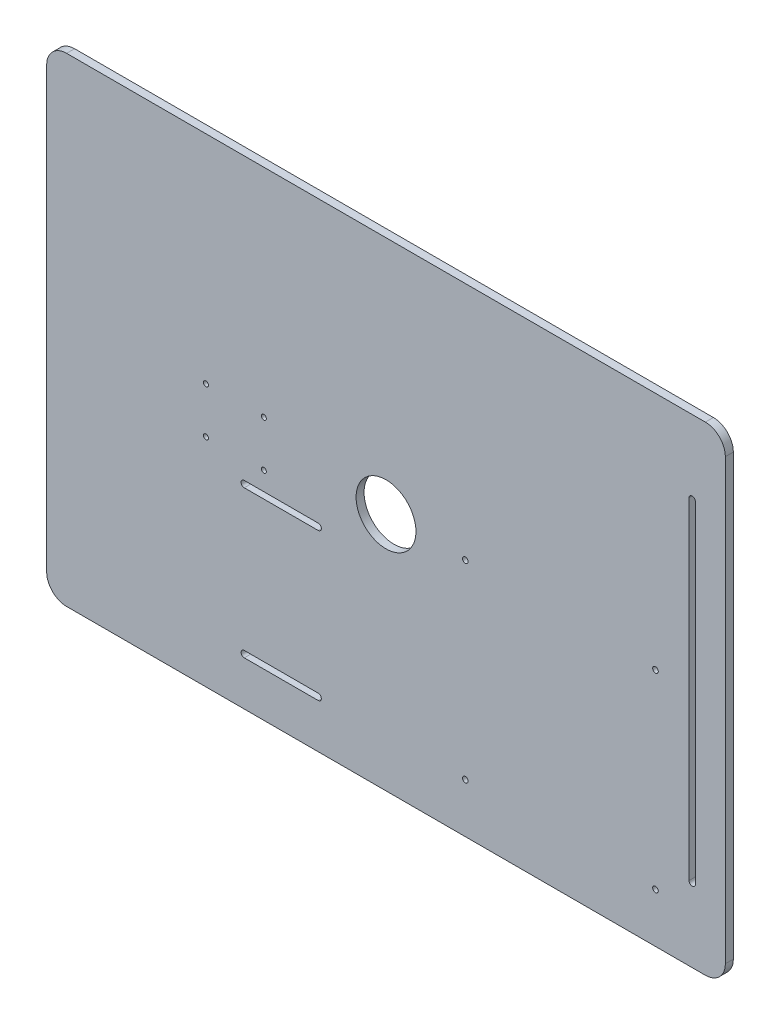
ISO-10303-21;
HEADER;
FILE_DESCRIPTION(('STEP AP214'),'2;1');
FILE_NAME('part.step','',(''),(''),'','','');
FILE_SCHEMA(('AUTOMOTIVE_DESIGN { 1 0 10303 214 1 1 1 1 }'));
ENDSEC;
DATA;
#1=APPLICATION_CONTEXT('core data for automotive mechanical design processes');
#2=APPLICATION_PROTOCOL_DEFINITION('international standard','automotive_design',2000,#1);
#3=PRODUCT_CONTEXT('',#1,'mechanical');
#4=PRODUCT('Part','Part','',(#3));
#5=PRODUCT_RELATED_PRODUCT_CATEGORY('part','',(#4));
#6=PRODUCT_DEFINITION_FORMATION('','',#4);
#7=PRODUCT_DEFINITION_CONTEXT('part definition',#1,'design');
#8=PRODUCT_DEFINITION('design','',#6,#7);
#9=PRODUCT_DEFINITION_SHAPE('','',#8);
#10=(LENGTH_UNIT() NAMED_UNIT(*) SI_UNIT(.MILLI.,.METRE.));
#11=(NAMED_UNIT(*) PLANE_ANGLE_UNIT() SI_UNIT($,.RADIAN.));
#12=(NAMED_UNIT(*) SI_UNIT($,.STERADIAN.) SOLID_ANGLE_UNIT());
#13=UNCERTAINTY_MEASURE_WITH_UNIT(LENGTH_MEASURE(1.E-05),#10,'distance_accuracy_value','');
#14=(GEOMETRIC_REPRESENTATION_CONTEXT(3) GLOBAL_UNCERTAINTY_ASSIGNED_CONTEXT((#13)) GLOBAL_UNIT_ASSIGNED_CONTEXT((#10,
#11,#12)) REPRESENTATION_CONTEXT('',''));
#15=CARTESIAN_POINT('',(0.,0.,0.));
#16=DIRECTION('',(0.,0.,1.));
#17=DIRECTION('',(1.,0.,0.));
#18=AXIS2_PLACEMENT_3D('',#15,#16,#17);
#19=CARTESIAN_POINT('',(160.,110.,4.));
#20=DIRECTION('',(0.,0.,1.));
#21=DIRECTION('',(1.,0.,0.));
#22=AXIS2_PLACEMENT_3D('',#19,#20,#21);
#23=PLANE('',#22);
#24=CARTESIAN_POINT('',(0.,0.,4.));
#25=DIRECTION('',(0.,0.,1.));
#26=DIRECTION('',(1.,0.,0.));
#27=AXIS2_PLACEMENT_3D('',#24,#25,#26);
#28=CIRCLE('',#27,15.);
#29=CARTESIAN_POINT('',(15.,0.,4.));
#30=VERTEX_POINT('',#29);
#31=EDGE_CURVE('E209',#30,#30,#28,.F.);
#32=ORIENTED_EDGE('',*,*,#31,.T.);
#33=EDGE_LOOP('',(#32));
#34=FACE_BOUND('',#33,.T.);
#35=CARTESIAN_POINT('',(135.,0.,4.));
#36=DIRECTION('',(0.,0.,1.));
#37=DIRECTION('',(1.,0.,0.));
#38=AXIS2_PLACEMENT_3D('',#35,#36,#37);
#39=CIRCLE('',#38,1.39999999999934);
#40=CARTESIAN_POINT('',(136.4,0.,4.));
#41=VERTEX_POINT('',#40);
#42=EDGE_CURVE('E272',#41,#41,#39,.F.);
#43=ORIENTED_EDGE('',*,*,#42,.T.);
#44=EDGE_LOOP('',(#43));
#45=FACE_BOUND('',#44,.T.);
#46=CARTESIAN_POINT('',(135.,-95.25,4.));
#47=DIRECTION('',(0.,0.,1.));
#48=DIRECTION('',(1.,0.,0.));
#49=AXIS2_PLACEMENT_3D('',#46,#47,#48);
#50=CIRCLE('',#49,1.39999999999977);
#51=CARTESIAN_POINT('',(136.4,-95.25,4.));
#52=VERTEX_POINT('',#51);
#53=EDGE_CURVE('E266',#52,#52,#50,.F.);
#54=ORIENTED_EDGE('',*,*,#53,.T.);
#55=EDGE_LOOP('',(#54));
#56=FACE_BOUND('',#55,.T.);
#57=CARTESIAN_POINT('',(153.4,83.0000013493322,4.));
#58=DIRECTION('',(0.,0.,1.));
#59=DIRECTION('',(1.,0.,0.));
#60=AXIS2_PLACEMENT_3D('',#57,#58,#59);
#61=CIRCLE('',#60,1.60000000000056);
#62=CARTESIAN_POINT('',(155.,83.,4.));
#63=VERTEX_POINT('',#62);
#64=CARTESIAN_POINT('',(151.8,83.,4.));
#65=VERTEX_POINT('',#64);
#66=EDGE_CURVE('E305',#63,#65,#61,.T.);
#67=ORIENTED_EDGE('',*,*,#66,.F.);
#68=DIRECTION('',(0.,1.,0.));
#69=VECTOR('',#68,1.);
#70=CARTESIAN_POINT('',(155.,110.,4.));
#71=LINE('',#70,#69);
#72=CARTESIAN_POINT('',(155.,-83.,4.));
#73=VERTEX_POINT('',#72);
#74=EDGE_CURVE('E292',#73,#63,#71,.T.);
#75=ORIENTED_EDGE('',*,*,#74,.F.);
#76=CARTESIAN_POINT('',(153.4,-83.0000013493322,4.));
#77=DIRECTION('',(0.,0.,1.));
#78=DIRECTION('',(1.,0.,0.));
#79=AXIS2_PLACEMENT_3D('',#76,#77,#78);
#80=CIRCLE('',#79,1.60000000000056);
#81=CARTESIAN_POINT('',(151.8,-83.,4.));
#82=VERTEX_POINT('',#81);
#83=EDGE_CURVE('E300',#73,#82,#80,.F.);
#84=ORIENTED_EDGE('',*,*,#83,.T.);
#85=DIRECTION('',(0.,-1.,0.));
#86=VECTOR('',#85,1.);
#87=CARTESIAN_POINT('',(151.8,110.,4.));
#88=LINE('',#87,#86);
#89=EDGE_CURVE('E303',#65,#82,#88,.T.);
#90=ORIENTED_EDGE('',*,*,#89,.F.);
#91=EDGE_LOOP('',(#67,#75,#84,#90));
#92=FACE_BOUND('',#91,.T.);
#93=CARTESIAN_POINT('',(-61.2053172509983,11.5,4.));
#94=DIRECTION('',(0.,0.,1.));
#95=DIRECTION('',(1.,0.,0.));
#96=AXIS2_PLACEMENT_3D('',#93,#94,#95);
#97=CIRCLE('',#96,1.25);
#98=CARTESIAN_POINT('',(-59.9553172509983,11.5,4.));
#99=VERTEX_POINT('',#98);
#100=EDGE_CURVE('E307',#99,#99,#97,.F.);
#101=ORIENTED_EDGE('',*,*,#100,.T.);
#102=EDGE_LOOP('',(#101));
#103=FACE_BOUND('',#102,.T.);
#104=CARTESIAN_POINT('',(-90.2053172509983,11.5,4.));
#105=DIRECTION('',(0.,0.,1.));
#106=DIRECTION('',(1.,0.,0.));
#107=AXIS2_PLACEMENT_3D('',#104,#105,#106);
#108=CIRCLE('',#107,1.25);
#109=CARTESIAN_POINT('',(-88.9553172509983,11.5,4.));
#110=VERTEX_POINT('',#109);
#111=EDGE_CURVE('E316',#110,#110,#108,.F.);
#112=ORIENTED_EDGE('',*,*,#111,.T.);
#113=EDGE_LOOP('',(#112));
#114=FACE_BOUND('',#113,.T.);
#115=CARTESIAN_POINT('',(160.,110.,4.));
#116=DIRECTION('',(0.,0.,1.));
#117=DIRECTION('',(1.,0.,0.));
#118=AXIS2_PLACEMENT_3D('',#115,#116,#117);
#119=CIRCLE('',#118,10.);
#120=CARTESIAN_POINT('',(170.,110.,4.));
#121=VERTEX_POINT('',#120);
#122=CARTESIAN_POINT('',(160.,120.,4.));
#123=VERTEX_POINT('',#122);
#124=EDGE_CURVE('E320',#121,#123,#119,.T.);
#125=ORIENTED_EDGE('',*,*,#124,.T.);
#126=DIRECTION('',(-1.,0.,0.));
#127=VECTOR('',#126,1.);
#128=CARTESIAN_POINT('',(160.,120.,4.));
#129=LINE('',#128,#127);
#130=CARTESIAN_POINT('',(-160.,120.,4.));
#131=VERTEX_POINT('',#130);
#132=EDGE_CURVE('E323',#123,#131,#129,.T.);
#133=ORIENTED_EDGE('',*,*,#132,.T.);
#134=CARTESIAN_POINT('',(-160.,110.,4.));
#135=DIRECTION('',(0.,0.,-1.));
#136=DIRECTION('',(-1.,0.,0.));
#137=AXIS2_PLACEMENT_3D('',#134,#135,#136);
#138=CIRCLE('',#137,10.);
#139=CARTESIAN_POINT('',(-170.,110.,4.));
#140=VERTEX_POINT('',#139);
#141=EDGE_CURVE('E326',#140,#131,#138,.T.);
#142=ORIENTED_EDGE('',*,*,#141,.F.);
#143=DIRECTION('',(0.,1.,0.));
#144=VECTOR('',#143,1.);
#145=CARTESIAN_POINT('',(-170.,-110.,4.));
#146=LINE('',#145,#144);
#147=CARTESIAN_POINT('',(-170.,-110.,4.));
#148=VERTEX_POINT('',#147);
#149=EDGE_CURVE('E329',#148,#140,#146,.T.);
#150=ORIENTED_EDGE('',*,*,#149,.F.);
#151=CARTESIAN_POINT('',(-160.,-110.,4.));
#152=DIRECTION('',(0.,0.,-1.));
#153=DIRECTION('',(-1.,0.,0.));
#154=AXIS2_PLACEMENT_3D('',#151,#152,#153);
#155=CIRCLE('',#154,10.);
#156=CARTESIAN_POINT('',(-160.,-120.,4.));
#157=VERTEX_POINT('',#156);
#158=EDGE_CURVE('E332',#157,#148,#155,.T.);
#159=ORIENTED_EDGE('',*,*,#158,.F.);
#160=DIRECTION('',(-1.,0.,0.));
#161=VECTOR('',#160,1.);
#162=CARTESIAN_POINT('',(160.,-120.,4.));
#163=LINE('',#162,#161);
#164=CARTESIAN_POINT('',(160.,-120.,4.));
#165=VERTEX_POINT('',#164);
#166=EDGE_CURVE('E335',#165,#157,#163,.T.);
#167=ORIENTED_EDGE('',*,*,#166,.F.);
#168=CARTESIAN_POINT('',(160.,-110.,4.));
#169=DIRECTION('',(0.,0.,1.));
#170=DIRECTION('',(1.,0.,0.));
#171=AXIS2_PLACEMENT_3D('',#168,#169,#170);
#172=CIRCLE('',#171,10.);
#173=CARTESIAN_POINT('',(170.,-110.,4.));
#174=VERTEX_POINT('',#173);
#175=EDGE_CURVE('E338',#165,#174,#172,.T.);
#176=ORIENTED_EDGE('',*,*,#175,.T.);
#177=DIRECTION('',(0.,1.,0.));
#178=VECTOR('',#177,1.);
#179=CARTESIAN_POINT('',(170.,-110.,4.));
#180=LINE('',#179,#178);
#181=EDGE_CURVE('E340',#174,#121,#180,.T.);
#182=ORIENTED_EDGE('',*,*,#181,.T.);
#183=EDGE_LOOP('',(#125,#133,#142,#150,#159,#167,#176,#182));
#184=FACE_BOUND('',#183,.T.);
#185=CARTESIAN_POINT('',(-90.2053172509983,-11.5,4.));
#186=DIRECTION('',(0.,0.,1.));
#187=DIRECTION('',(1.,0.,0.));
#188=AXIS2_PLACEMENT_3D('',#185,#186,#187);
#189=CIRCLE('',#188,1.25);
#190=CARTESIAN_POINT('',(-88.9553172509983,-11.5,4.));
#191=VERTEX_POINT('',#190);
#192=EDGE_CURVE('E381',#191,#191,#189,.F.);
#193=ORIENTED_EDGE('',*,*,#192,.T.);
#194=EDGE_LOOP('',(#193));
#195=FACE_BOUND('',#194,.T.);
#196=CARTESIAN_POINT('',(-61.2053172509983,-11.5,4.));
#197=DIRECTION('',(0.,0.,1.));
#198=DIRECTION('',(1.,0.,0.));
#199=AXIS2_PLACEMENT_3D('',#196,#197,#198);
#200=CIRCLE('',#199,1.25);
#201=CARTESIAN_POINT('',(-59.9553172509983,-11.5,4.));
#202=VERTEX_POINT('',#201);
#203=EDGE_CURVE('E49',#202,#202,#200,.F.);
#204=ORIENTED_EDGE('',*,*,#203,.T.);
#205=EDGE_LOOP('',(#204));
#206=FACE_BOUND('',#205,.T.);
#207=CARTESIAN_POINT('',(39.7500000000004,0.,4.));
#208=DIRECTION('',(0.,0.,1.));
#209=DIRECTION('',(1.,0.,0.));
#210=AXIS2_PLACEMENT_3D('',#207,#208,#209);
#211=CIRCLE('',#210,1.39999999999939);
#212=CARTESIAN_POINT('',(41.1499999999997,0.,4.));
#213=VERTEX_POINT('',#212);
#214=EDGE_CURVE('E269',#213,#213,#211,.T.);
#215=ORIENTED_EDGE('',*,*,#214,.F.);
#216=EDGE_LOOP('',(#215));
#217=FACE_BOUND('',#216,.T.);
#218=CARTESIAN_POINT('',(39.75,-95.2499999999997,4.));
#219=DIRECTION('',(0.,0.,1.));
#220=DIRECTION('',(1.,0.,0.));
#221=AXIS2_PLACEMENT_3D('',#218,#219,#220);
#222=CIRCLE('',#221,1.39999999999957);
#223=CARTESIAN_POINT('',(41.1499999999996,-95.2499999999997,4.));
#224=VERTEX_POINT('',#223);
#225=EDGE_CURVE('E275',#224,#224,#222,.T.);
#226=ORIENTED_EDGE('',*,*,#225,.F.);
#227=EDGE_LOOP('',(#226));
#228=FACE_BOUND('',#227,.T.);
#229=DIRECTION('',(-1.,0.,0.));
#230=VECTOR('',#229,1.);
#231=CARTESIAN_POINT('',(160.,-97.7703170461152,4.));
#232=LINE('',#231,#230);
#233=CARTESIAN_POINT('',(-34.,-97.7703170461153,4.));
#234=VERTEX_POINT('',#233);
#235=CARTESIAN_POINT('',(-71.,-97.7703170461153,4.));
#236=VERTEX_POINT('',#235);
#237=EDGE_CURVE('E239',#234,#236,#232,.T.);
#238=ORIENTED_EDGE('',*,*,#237,.T.);
#239=CARTESIAN_POINT('',(-71.,-96.1703170461153,4.));
#240=DIRECTION('',(0.,0.,1.));
#241=DIRECTION('',(1.,0.,0.));
#242=AXIS2_PLACEMENT_3D('',#239,#240,#241);
#243=CIRCLE('',#242,1.60000000000001);
#244=CARTESIAN_POINT('',(-71.,-94.5703170461152,4.));
#245=VERTEX_POINT('',#244);
#246=EDGE_CURVE('E242',#236,#245,#243,.F.);
#247=ORIENTED_EDGE('',*,*,#246,.T.);
#248=DIRECTION('',(1.,0.,0.));
#249=VECTOR('',#248,1.);
#250=CARTESIAN_POINT('',(160.,-94.5703170461154,4.));
#251=LINE('',#250,#249);
#252=CARTESIAN_POINT('',(-34.,-94.5703170461153,4.));
#253=VERTEX_POINT('',#252);
#254=EDGE_CURVE('E188',#245,#253,#251,.T.);
#255=ORIENTED_EDGE('',*,*,#254,.T.);
#256=CARTESIAN_POINT('',(-34.,-96.1703170461153,4.));
#257=DIRECTION('',(0.,0.,1.));
#258=DIRECTION('',(1.,0.,0.));
#259=AXIS2_PLACEMENT_3D('',#256,#257,#258);
#260=CIRCLE('',#259,1.6);
#261=EDGE_CURVE('E236',#253,#234,#260,.F.);
#262=ORIENTED_EDGE('',*,*,#261,.T.);
#263=EDGE_LOOP('',(#238,#247,#255,#262));
#264=FACE_BOUND('',#263,.T.);
#265=DIRECTION('',(1.,0.,0.));
#266=VECTOR('',#265,1.);
#267=CARTESIAN_POINT('',(160.,-20.8,4.));
#268=LINE('',#267,#266);
#269=CARTESIAN_POINT('',(-71.,-20.8,4.));
#270=VERTEX_POINT('',#269);
#271=CARTESIAN_POINT('',(-34.,-20.8,4.));
#272=VERTEX_POINT('',#271);
#273=EDGE_CURVE('E251',#270,#272,#268,.T.);
#274=ORIENTED_EDGE('',*,*,#273,.T.);
#275=CARTESIAN_POINT('',(-34.,-22.4,4.));
#276=DIRECTION('',(0.,0.,1.));
#277=DIRECTION('',(1.,0.,0.));
#278=AXIS2_PLACEMENT_3D('',#275,#276,#277);
#279=CIRCLE('',#278,1.6);
#280=CARTESIAN_POINT('',(-34.,-24.,4.));
#281=VERTEX_POINT('',#280);
#282=EDGE_CURVE('E185',#272,#281,#279,.F.);
#283=ORIENTED_EDGE('',*,*,#282,.T.);
#284=DIRECTION('',(-1.,0.,0.));
#285=VECTOR('',#284,1.);
#286=CARTESIAN_POINT('',(160.,-23.9999999999999,4.));
#287=LINE('',#286,#285);
#288=CARTESIAN_POINT('',(-71.,-24.,4.));
#289=VERTEX_POINT('',#288);
#290=EDGE_CURVE('E245',#281,#289,#287,.T.);
#291=ORIENTED_EDGE('',*,*,#290,.T.);
#292=CARTESIAN_POINT('',(-71.,-22.4,4.));
#293=DIRECTION('',(0.,0.,1.));
#294=DIRECTION('',(1.,0.,0.));
#295=AXIS2_PLACEMENT_3D('',#292,#293,#294);
#296=CIRCLE('',#295,1.6);
#297=EDGE_CURVE('E248',#289,#270,#296,.F.);
#298=ORIENTED_EDGE('',*,*,#297,.T.);
#299=EDGE_LOOP('',(#274,#283,#291,#298));
#300=FACE_BOUND('',#299,.T.);
#301=ADVANCED_FACE('F41',(#34,#45,#56,#92,#103,#114,#184,#195,#206,#217,#228,#264,#300),#23,.T.);
#302=CARTESIAN_POINT('',(160.,110.,0.));
#303=DIRECTION('',(0.,0.,1.));
#304=DIRECTION('',(1.,0.,0.));
#305=AXIS2_PLACEMENT_3D('',#302,#303,#304);
#306=PLANE('',#305);
#307=CARTESIAN_POINT('',(0.,0.,0.));
#308=DIRECTION('',(0.,0.,1.));
#309=DIRECTION('',(1.,0.,0.));
#310=AXIS2_PLACEMENT_3D('',#307,#308,#309);
#311=CIRCLE('',#310,15.);
#312=CARTESIAN_POINT('',(15.,0.,0.));
#313=VERTEX_POINT('',#312);
#314=EDGE_CURVE('E641',#313,#313,#311,.T.);
#315=ORIENTED_EDGE('',*,*,#314,.T.);
#316=EDGE_LOOP('',(#315));
#317=FACE_BOUND('',#316,.T.);
#318=CARTESIAN_POINT('',(-71.,-96.1703170461153,0.));
#319=DIRECTION('',(0.,0.,1.));
#320=DIRECTION('',(1.,0.,0.));
#321=AXIS2_PLACEMENT_3D('',#318,#319,#320);
#322=CIRCLE('',#321,1.60000000000001);
#323=CARTESIAN_POINT('',(-71.,-94.5703170461153,0.));
#324=VERTEX_POINT('',#323);
#325=CARTESIAN_POINT('',(-71.,-97.7703170461153,0.));
#326=VERTEX_POINT('',#325);
#327=EDGE_CURVE('E203',#324,#326,#322,.T.);
#328=ORIENTED_EDGE('',*,*,#327,.T.);
#329=DIRECTION('',(1.,0.,0.));
#330=VECTOR('',#329,1.);
#331=CARTESIAN_POINT('',(-34.,-97.7703170461153,0.));
#332=LINE('',#331,#330);
#333=CARTESIAN_POINT('',(-34.,-97.7703170461153,0.));
#334=VERTEX_POINT('',#333);
#335=EDGE_CURVE('E206',#326,#334,#332,.T.);
#336=ORIENTED_EDGE('',*,*,#335,.T.);
#337=CARTESIAN_POINT('',(-34.,-96.1703170461153,0.));
#338=DIRECTION('',(0.,0.,1.));
#339=DIRECTION('',(-1.,0.,0.));
#340=AXIS2_PLACEMENT_3D('',#337,#338,#339);
#341=CIRCLE('',#340,1.6);
#342=CARTESIAN_POINT('',(-34.,-94.5703170461153,0.));
#343=VERTEX_POINT('',#342);
#344=EDGE_CURVE('E229',#334,#343,#341,.T.);
#345=ORIENTED_EDGE('',*,*,#344,.T.);
#346=DIRECTION('',(-1.,0.,0.));
#347=VECTOR('',#346,1.);
#348=CARTESIAN_POINT('',(-34.,-94.5703170461153,0.));
#349=LINE('',#348,#347);
#350=EDGE_CURVE('E226',#343,#324,#349,.T.);
#351=ORIENTED_EDGE('',*,*,#350,.T.);
#352=EDGE_LOOP('',(#328,#336,#345,#351));
#353=FACE_BOUND('',#352,.T.);
#354=CARTESIAN_POINT('',(39.7500000000004,0.,0.));
#355=DIRECTION('',(0.,0.,-1.));
#356=DIRECTION('',(-1.,0.,0.));
#357=AXIS2_PLACEMENT_3D('',#354,#355,#356);
#358=CIRCLE('',#357,1.39999999999939);
#359=CARTESIAN_POINT('',(38.350000000001,0.,0.));
#360=VERTEX_POINT('',#359);
#361=EDGE_CURVE('E254',#360,#360,#358,.T.);
#362=ORIENTED_EDGE('',*,*,#361,.F.);
#363=EDGE_LOOP('',(#362));
#364=FACE_BOUND('',#363,.T.);
#365=CARTESIAN_POINT('',(135.,-95.25,0.));
#366=DIRECTION('',(0.,0.,1.));
#367=DIRECTION('',(1.,0.,0.));
#368=AXIS2_PLACEMENT_3D('',#365,#366,#367);
#369=CIRCLE('',#368,1.39999999999977);
#370=CARTESIAN_POINT('',(136.4,-95.25,0.));
#371=VERTEX_POINT('',#370);
#372=EDGE_CURVE('E261',#371,#371,#369,.T.);
#373=ORIENTED_EDGE('',*,*,#372,.T.);
#374=EDGE_LOOP('',(#373));
#375=FACE_BOUND('',#374,.T.);
#376=DIRECTION('',(0.,-1.,0.));
#377=VECTOR('',#376,1.);
#378=CARTESIAN_POINT('',(155.,83.,0.));
#379=LINE('',#378,#377);
#380=CARTESIAN_POINT('',(155.,83.,0.));
#381=VERTEX_POINT('',#380);
#382=CARTESIAN_POINT('',(155.,-83.,0.));
#383=VERTEX_POINT('',#382);
#384=EDGE_CURVE('E280',#381,#383,#379,.T.);
#385=ORIENTED_EDGE('',*,*,#384,.F.);
#386=CARTESIAN_POINT('',(153.4,83.0000013493322,0.));
#387=DIRECTION('',(0.,0.,-1.));
#388=DIRECTION('',(-1.,0.,0.));
#389=AXIS2_PLACEMENT_3D('',#386,#387,#388);
#390=CIRCLE('',#389,1.60000000000056);
#391=CARTESIAN_POINT('',(151.8,83.,0.));
#392=VERTEX_POINT('',#391);
#393=EDGE_CURVE('E278',#392,#381,#390,.T.);
#394=ORIENTED_EDGE('',*,*,#393,.F.);
#395=DIRECTION('',(0.,1.,0.));
#396=VECTOR('',#395,1.);
#397=CARTESIAN_POINT('',(151.8,-83.,0.));
#398=LINE('',#397,#396);
#399=CARTESIAN_POINT('',(151.8,-83.,0.));
#400=VERTEX_POINT('',#399);
#401=EDGE_CURVE('E286',#400,#392,#398,.T.);
#402=ORIENTED_EDGE('',*,*,#401,.F.);
#403=CARTESIAN_POINT('',(153.4,-83.0000013493322,0.));
#404=DIRECTION('',(0.,0.,1.));
#405=DIRECTION('',(1.,0.,0.));
#406=AXIS2_PLACEMENT_3D('',#403,#404,#405);
#407=CIRCLE('',#406,1.60000000000056);
#408=EDGE_CURVE('E283',#400,#383,#407,.T.);
#409=ORIENTED_EDGE('',*,*,#408,.T.);
#410=EDGE_LOOP('',(#385,#394,#402,#409));
#411=FACE_BOUND('',#410,.T.);
#412=CARTESIAN_POINT('',(-61.2053172509983,11.5,0.));
#413=DIRECTION('',(0.,0.,1.));
#414=DIRECTION('',(1.,0.,0.));
#415=AXIS2_PLACEMENT_3D('',#412,#413,#414);
#416=CIRCLE('',#415,1.25);
#417=CARTESIAN_POINT('',(-59.9553172509983,11.5,0.));
#418=VERTEX_POINT('',#417);
#419=EDGE_CURVE('E310',#418,#418,#416,.T.);
#420=ORIENTED_EDGE('',*,*,#419,.T.);
#421=EDGE_LOOP('',(#420));
#422=FACE_BOUND('',#421,.T.);
#423=CARTESIAN_POINT('',(-90.2053172509983,11.5,0.));
#424=DIRECTION('',(0.,0.,1.));
#425=DIRECTION('',(1.,0.,0.));
#426=AXIS2_PLACEMENT_3D('',#423,#424,#425);
#427=CIRCLE('',#426,1.25);
#428=CARTESIAN_POINT('',(-88.9553172509983,11.5,0.));
#429=VERTEX_POINT('',#428);
#430=EDGE_CURVE('E313',#429,#429,#427,.T.);
#431=ORIENTED_EDGE('',*,*,#430,.T.);
#432=EDGE_LOOP('',(#431));
#433=FACE_BOUND('',#432,.T.);
#434=CARTESIAN_POINT('',(160.,110.,0.));
#435=DIRECTION('',(0.,0.,1.));
#436=DIRECTION('',(1.,0.,0.));
#437=AXIS2_PLACEMENT_3D('',#434,#435,#436);
#438=CIRCLE('',#437,10.);
#439=CARTESIAN_POINT('',(170.,110.,0.));
#440=VERTEX_POINT('',#439);
#441=CARTESIAN_POINT('',(160.,120.,0.));
#442=VERTEX_POINT('',#441);
#443=EDGE_CURVE('E319',#440,#442,#438,.T.);
#444=ORIENTED_EDGE('',*,*,#443,.F.);
#445=DIRECTION('',(0.,1.,0.));
#446=VECTOR('',#445,1.);
#447=CARTESIAN_POINT('',(170.,-110.,0.));
#448=LINE('',#447,#446);
#449=CARTESIAN_POINT('',(170.,-110.,0.));
#450=VERTEX_POINT('',#449);
#451=EDGE_CURVE('E324',#450,#440,#448,.T.);
#452=ORIENTED_EDGE('',*,*,#451,.F.);
#453=CARTESIAN_POINT('',(160.,-110.,0.));
#454=DIRECTION('',(0.,0.,1.));
#455=DIRECTION('',(1.,0.,0.));
#456=AXIS2_PLACEMENT_3D('',#453,#454,#455);
#457=CIRCLE('',#456,10.);
#458=CARTESIAN_POINT('',(160.,-120.,0.));
#459=VERTEX_POINT('',#458);
#460=EDGE_CURVE('E360',#459,#450,#457,.T.);
#461=ORIENTED_EDGE('',*,*,#460,.F.);
#462=DIRECTION('',(-1.,0.,0.));
#463=VECTOR('',#462,1.);
#464=CARTESIAN_POINT('',(160.,-120.,0.));
#465=LINE('',#464,#463);
#466=CARTESIAN_POINT('',(-160.,-120.,0.));
#467=VERTEX_POINT('',#466);
#468=EDGE_CURVE('E357',#459,#467,#465,.T.);
#469=ORIENTED_EDGE('',*,*,#468,.T.);
#470=CARTESIAN_POINT('',(-160.,-110.,0.));
#471=DIRECTION('',(0.,0.,-1.));
#472=DIRECTION('',(-1.,0.,0.));
#473=AXIS2_PLACEMENT_3D('',#470,#471,#472);
#474=CIRCLE('',#473,10.);
#475=CARTESIAN_POINT('',(-170.,-110.,0.));
#476=VERTEX_POINT('',#475);
#477=EDGE_CURVE('E354',#467,#476,#474,.T.);
#478=ORIENTED_EDGE('',*,*,#477,.T.);
#479=DIRECTION('',(0.,1.,0.));
#480=VECTOR('',#479,1.);
#481=CARTESIAN_POINT('',(-170.,-110.,0.));
#482=LINE('',#481,#480);
#483=CARTESIAN_POINT('',(-170.,110.,0.));
#484=VERTEX_POINT('',#483);
#485=EDGE_CURVE('E351',#476,#484,#482,.T.);
#486=ORIENTED_EDGE('',*,*,#485,.T.);
#487=CARTESIAN_POINT('',(-160.,110.,0.));
#488=DIRECTION('',(0.,0.,-1.));
#489=DIRECTION('',(-1.,0.,0.));
#490=AXIS2_PLACEMENT_3D('',#487,#488,#489);
#491=CIRCLE('',#490,10.);
#492=CARTESIAN_POINT('',(-160.,120.,0.));
#493=VERTEX_POINT('',#492);
#494=EDGE_CURVE('E348',#484,#493,#491,.T.);
#495=ORIENTED_EDGE('',*,*,#494,.T.);
#496=DIRECTION('',(-1.,0.,0.));
#497=VECTOR('',#496,1.);
#498=CARTESIAN_POINT('',(160.,120.,0.));
#499=LINE('',#498,#497);
#500=EDGE_CURVE('E345',#442,#493,#499,.T.);
#501=ORIENTED_EDGE('',*,*,#500,.F.);
#502=EDGE_LOOP('',(#444,#452,#461,#469,#478,#486,#495,#501));
#503=FACE_BOUND('',#502,.T.);
#504=CARTESIAN_POINT('',(-90.2053172509983,-11.5,0.));
#505=DIRECTION('',(0.,0.,1.));
#506=DIRECTION('',(1.,0.,0.));
#507=AXIS2_PLACEMENT_3D('',#504,#505,#506);
#508=CIRCLE('',#507,1.25);
#509=CARTESIAN_POINT('',(-88.9553172509983,-11.5,0.));
#510=VERTEX_POINT('',#509);
#511=EDGE_CURVE('E384',#510,#510,#508,.T.);
#512=ORIENTED_EDGE('',*,*,#511,.T.);
#513=EDGE_LOOP('',(#512));
#514=FACE_BOUND('',#513,.T.);
#515=CARTESIAN_POINT('',(-61.2053172509983,-11.5,0.));
#516=DIRECTION('',(0.,0.,1.));
#517=DIRECTION('',(1.,0.,0.));
#518=AXIS2_PLACEMENT_3D('',#515,#516,#517);
#519=CIRCLE('',#518,1.25);
#520=CARTESIAN_POINT('',(-59.9553172509983,-11.5,0.));
#521=VERTEX_POINT('',#520);
#522=EDGE_CURVE('E11',#521,#521,#519,.T.);
#523=ORIENTED_EDGE('',*,*,#522,.T.);
#524=EDGE_LOOP('',(#523));
#525=FACE_BOUND('',#524,.T.);
#526=CARTESIAN_POINT('',(135.,0.,0.));
#527=DIRECTION('',(0.,0.,1.));
#528=DIRECTION('',(1.,0.,0.));
#529=AXIS2_PLACEMENT_3D('',#526,#527,#528);
#530=CIRCLE('',#529,1.39999999999934);
#531=CARTESIAN_POINT('',(136.4,0.,0.));
#532=VERTEX_POINT('',#531);
#533=EDGE_CURVE('E257',#532,#532,#530,.T.);
#534=ORIENTED_EDGE('',*,*,#533,.T.);
#535=EDGE_LOOP('',(#534));
#536=FACE_BOUND('',#535,.T.);
#537=CARTESIAN_POINT('',(39.75,-95.2499999999997,0.));
#538=DIRECTION('',(0.,0.,-1.));
#539=DIRECTION('',(-1.,0.,0.));
#540=AXIS2_PLACEMENT_3D('',#537,#538,#539);
#541=CIRCLE('',#540,1.39999999999957);
#542=CARTESIAN_POINT('',(38.3500000000005,-95.2499999999997,0.));
#543=VERTEX_POINT('',#542);
#544=EDGE_CURVE('E258',#543,#543,#541,.T.);
#545=ORIENTED_EDGE('',*,*,#544,.F.);
#546=EDGE_LOOP('',(#545));
#547=FACE_BOUND('',#546,.T.);
#548=CARTESIAN_POINT('',(-34.,-22.4,0.));
#549=DIRECTION('',(0.,0.,1.));
#550=DIRECTION('',(1.,0.,0.));
#551=AXIS2_PLACEMENT_3D('',#548,#549,#550);
#552=CIRCLE('',#551,1.6);
#553=CARTESIAN_POINT('',(-34.,-24.,0.));
#554=VERTEX_POINT('',#553);
#555=CARTESIAN_POINT('',(-34.,-20.8,0.));
#556=VERTEX_POINT('',#555);
#557=EDGE_CURVE('E182',#554,#556,#552,.T.);
#558=ORIENTED_EDGE('',*,*,#557,.T.);
#559=DIRECTION('',(-1.,0.,0.));
#560=VECTOR('',#559,1.);
#561=CARTESIAN_POINT('',(-34.,-20.8,0.));
#562=LINE('',#561,#560);
#563=CARTESIAN_POINT('',(-71.,-20.8,0.));
#564=VERTEX_POINT('',#563);
#565=EDGE_CURVE('E192',#556,#564,#562,.T.);
#566=ORIENTED_EDGE('',*,*,#565,.T.);
#567=CARTESIAN_POINT('',(-71.,-22.4,0.));
#568=DIRECTION('',(0.,0.,1.));
#569=DIRECTION('',(-1.,0.,0.));
#570=AXIS2_PLACEMENT_3D('',#567,#568,#569);
#571=CIRCLE('',#570,1.6);
#572=CARTESIAN_POINT('',(-71.,-24.,0.));
#573=VERTEX_POINT('',#572);
#574=EDGE_CURVE('E198',#564,#573,#571,.T.);
#575=ORIENTED_EDGE('',*,*,#574,.T.);
#576=DIRECTION('',(1.,0.,0.));
#577=VECTOR('',#576,1.);
#578=CARTESIAN_POINT('',(-34.,-24.,0.));
#579=LINE('',#578,#577);
#580=EDGE_CURVE('E202',#573,#554,#579,.T.);
#581=ORIENTED_EDGE('',*,*,#580,.T.);
#582=EDGE_LOOP('',(#558,#566,#575,#581));
#583=FACE_BOUND('',#582,.T.);
#584=ADVANCED_FACE('F201',(#317,#353,#364,#375,#411,#422,#433,#503,#514,#525,#536,#547,#583),
#306,.F.);
#585=CARTESIAN_POINT('',(-61.2053172509983,-11.5,10.));
#586=DIRECTION('',(0.,0.,-1.));
#587=DIRECTION('',(-1.,0.,0.));
#588=AXIS2_PLACEMENT_3D('',#585,#586,#587);
#589=CYLINDRICAL_SURFACE('',#588,1.25);
#590=ORIENTED_EDGE('',*,*,#203,.F.);
#591=EDGE_LOOP('',(#590));
#592=FACE_BOUND('',#591,.T.);
#593=ORIENTED_EDGE('',*,*,#522,.F.);
#594=EDGE_LOOP('',(#593));
#595=FACE_BOUND('',#594,.T.);
#596=ADVANCED_FACE('F43',(#592,#595),#589,.F.);
#597=CARTESIAN_POINT('',(-90.2053172509983,-11.5,10.));
#598=DIRECTION('',(0.,0.,-1.));
#599=DIRECTION('',(-1.,0.,0.));
#600=AXIS2_PLACEMENT_3D('',#597,#598,#599);
#601=CYLINDRICAL_SURFACE('',#600,1.25);
#602=ORIENTED_EDGE('',*,*,#192,.F.);
#603=EDGE_LOOP('',(#602));
#604=FACE_BOUND('',#603,.T.);
#605=ORIENTED_EDGE('',*,*,#511,.F.);
#606=EDGE_LOOP('',(#605));
#607=FACE_BOUND('',#606,.T.);
#608=ADVANCED_FACE('F393',(#604,#607),#601,.F.);
#609=CARTESIAN_POINT('',(160.,110.,4.));
#610=DIRECTION('',(0.,0.,-1.));
#611=DIRECTION('',(-1.,0.,0.));
#612=AXIS2_PLACEMENT_3D('',#609,#610,#611);
#613=CYLINDRICAL_SURFACE('',#612,10.);
#614=ORIENTED_EDGE('',*,*,#443,.T.);
#615=DIRECTION('',(0.,0.,-1.));
#616=VECTOR('',#615,1.);
#617=CARTESIAN_POINT('',(160.,120.,4.));
#618=LINE('',#617,#616);
#619=EDGE_CURVE('E378',#123,#442,#618,.T.);
#620=ORIENTED_EDGE('',*,*,#619,.F.);
#621=ORIENTED_EDGE('',*,*,#124,.F.);
#622=DIRECTION('',(0.,0.,-1.));
#623=VECTOR('',#622,1.);
#624=CARTESIAN_POINT('',(170.,110.,4.));
#625=LINE('',#624,#623);
#626=EDGE_CURVE('E342',#121,#440,#625,.T.);
#627=ORIENTED_EDGE('',*,*,#626,.T.);
#628=EDGE_LOOP('',(#614,#620,#621,#627));
#629=FACE_BOUND('',#628,.T.);
#630=ADVANCED_FACE('F460',(#629),#613,.T.);
#631=CARTESIAN_POINT('',(160.,120.,4.));
#632=DIRECTION('',(0.,-1.,0.));
#633=DIRECTION('',(1.,0.,0.));
#634=AXIS2_PLACEMENT_3D('',#631,#632,#633);
#635=PLANE('',#634);
#636=ORIENTED_EDGE('',*,*,#500,.T.);
#637=DIRECTION('',(0.,0.,-1.));
#638=VECTOR('',#637,1.);
#639=CARTESIAN_POINT('',(-160.,120.,4.));
#640=LINE('',#639,#638);
#641=EDGE_CURVE('E376',#131,#493,#640,.T.);
#642=ORIENTED_EDGE('',*,*,#641,.F.);
#643=ORIENTED_EDGE('',*,*,#132,.F.);
#644=ORIENTED_EDGE('',*,*,#619,.T.);
#645=EDGE_LOOP('',(#636,#642,#643,#644));
#646=FACE_BOUND('',#645,.T.);
#647=ADVANCED_FACE('F456',(#646),#635,.F.);
#648=CARTESIAN_POINT('',(-160.,110.,4.));
#649=DIRECTION('',(0.,0.,-1.));
#650=DIRECTION('',(-1.,0.,0.));
#651=AXIS2_PLACEMENT_3D('',#648,#649,#650);
#652=CYLINDRICAL_SURFACE('',#651,10.);
#653=ORIENTED_EDGE('',*,*,#494,.F.);
#654=DIRECTION('',(0.,0.,-1.));
#655=VECTOR('',#654,1.);
#656=CARTESIAN_POINT('',(-170.,110.,4.));
#657=LINE('',#656,#655);
#658=EDGE_CURVE('E374',#140,#484,#657,.T.);
#659=ORIENTED_EDGE('',*,*,#658,.F.);
#660=ORIENTED_EDGE('',*,*,#141,.T.);
#661=ORIENTED_EDGE('',*,*,#641,.T.);
#662=EDGE_LOOP('',(#653,#659,#660,#661));
#663=FACE_BOUND('',#662,.T.);
#664=ADVANCED_FACE('F452',(#663),#652,.T.);
#665=CARTESIAN_POINT('',(-170.,-110.,4.));
#666=DIRECTION('',(-1.,0.,0.));
#667=DIRECTION('',(0.,-1.,0.));
#668=AXIS2_PLACEMENT_3D('',#665,#666,#667);
#669=PLANE('',#668);
#670=ORIENTED_EDGE('',*,*,#485,.F.);
#671=DIRECTION('',(0.,0.,-1.));
#672=VECTOR('',#671,1.);
#673=CARTESIAN_POINT('',(-170.,-110.,4.));
#674=LINE('',#673,#672);
#675=EDGE_CURVE('E372',#148,#476,#674,.T.);
#676=ORIENTED_EDGE('',*,*,#675,.F.);
#677=ORIENTED_EDGE('',*,*,#149,.T.);
#678=ORIENTED_EDGE('',*,*,#658,.T.);
#679=EDGE_LOOP('',(#670,#676,#677,#678));
#680=FACE_BOUND('',#679,.T.);
#681=ADVANCED_FACE('F448',(#680),#669,.T.);
#682=CARTESIAN_POINT('',(-160.,-110.,4.));
#683=DIRECTION('',(0.,0.,-1.));
#684=DIRECTION('',(-1.,0.,0.));
#685=AXIS2_PLACEMENT_3D('',#682,#683,#684);
#686=CYLINDRICAL_SURFACE('',#685,10.);
#687=ORIENTED_EDGE('',*,*,#477,.F.);
#688=DIRECTION('',(0.,0.,-1.));
#689=VECTOR('',#688,1.);
#690=CARTESIAN_POINT('',(-160.,-120.,4.));
#691=LINE('',#690,#689);
#692=EDGE_CURVE('E370',#157,#467,#691,.T.);
#693=ORIENTED_EDGE('',*,*,#692,.F.);
#694=ORIENTED_EDGE('',*,*,#158,.T.);
#695=ORIENTED_EDGE('',*,*,#675,.T.);
#696=EDGE_LOOP('',(#687,#693,#694,#695));
#697=FACE_BOUND('',#696,.T.);
#698=ADVANCED_FACE('F444',(#697),#686,.T.);
#699=CARTESIAN_POINT('',(160.,-120.,4.));
#700=DIRECTION('',(0.,-1.,0.));
#701=DIRECTION('',(1.,0.,0.));
#702=AXIS2_PLACEMENT_3D('',#699,#700,#701);
#703=PLANE('',#702);
#704=ORIENTED_EDGE('',*,*,#468,.F.);
#705=DIRECTION('',(0.,0.,-1.));
#706=VECTOR('',#705,1.);
#707=CARTESIAN_POINT('',(160.,-120.,4.));
#708=LINE('',#707,#706);
#709=EDGE_CURVE('E368',#165,#459,#708,.T.);
#710=ORIENTED_EDGE('',*,*,#709,.F.);
#711=ORIENTED_EDGE('',*,*,#166,.T.);
#712=ORIENTED_EDGE('',*,*,#692,.T.);
#713=EDGE_LOOP('',(#704,#710,#711,#712));
#714=FACE_BOUND('',#713,.T.);
#715=ADVANCED_FACE('F440',(#714),#703,.T.);
#716=CARTESIAN_POINT('',(160.,-110.,4.));
#717=DIRECTION('',(0.,0.,-1.));
#718=DIRECTION('',(-1.,0.,0.));
#719=AXIS2_PLACEMENT_3D('',#716,#717,#718);
#720=CYLINDRICAL_SURFACE('',#719,10.);
#721=ORIENTED_EDGE('',*,*,#460,.T.);
#722=DIRECTION('',(0.,0.,-1.));
#723=VECTOR('',#722,1.);
#724=CARTESIAN_POINT('',(170.,-110.,4.));
#725=LINE('',#724,#723);
#726=EDGE_CURVE('E365',#174,#450,#725,.T.);
#727=ORIENTED_EDGE('',*,*,#726,.F.);
#728=ORIENTED_EDGE('',*,*,#175,.F.);
#729=ORIENTED_EDGE('',*,*,#709,.T.);
#730=EDGE_LOOP('',(#721,#727,#728,#729));
#731=FACE_BOUND('',#730,.T.);
#732=ADVANCED_FACE('F436',(#731),#720,.T.);
#733=CARTESIAN_POINT('',(170.,-110.,4.));
#734=DIRECTION('',(-1.,0.,0.));
#735=DIRECTION('',(0.,0.,1.));
#736=AXIS2_PLACEMENT_3D('',#733,#734,#735);
#737=PLANE('',#736);
#738=ORIENTED_EDGE('',*,*,#451,.T.);
#739=ORIENTED_EDGE('',*,*,#626,.F.);
#740=ORIENTED_EDGE('',*,*,#181,.F.);
#741=ORIENTED_EDGE('',*,*,#726,.T.);
#742=EDGE_LOOP('',(#738,#739,#740,#741));
#743=FACE_BOUND('',#742,.T.);
#744=ADVANCED_FACE('F433',(#743),#737,.F.);
#745=CARTESIAN_POINT('',(-90.2053172509983,11.5,10.));
#746=DIRECTION('',(0.,0.,-1.));
#747=DIRECTION('',(-1.,0.,0.));
#748=AXIS2_PLACEMENT_3D('',#745,#746,#747);
#749=CYLINDRICAL_SURFACE('',#748,1.25);
#750=ORIENTED_EDGE('',*,*,#111,.F.);
#751=EDGE_LOOP('',(#750));
#752=FACE_BOUND('',#751,.T.);
#753=ORIENTED_EDGE('',*,*,#430,.F.);
#754=EDGE_LOOP('',(#753));
#755=FACE_BOUND('',#754,.T.);
#756=ADVANCED_FACE('F430',(#752,#755),#749,.F.);
#757=CARTESIAN_POINT('',(-61.2053172509983,11.5,10.));
#758=DIRECTION('',(0.,0.,-1.));
#759=DIRECTION('',(-1.,0.,0.));
#760=AXIS2_PLACEMENT_3D('',#757,#758,#759);
#761=CYLINDRICAL_SURFACE('',#760,1.25);
#762=ORIENTED_EDGE('',*,*,#100,.F.);
#763=EDGE_LOOP('',(#762));
#764=FACE_BOUND('',#763,.T.);
#765=ORIENTED_EDGE('',*,*,#419,.F.);
#766=EDGE_LOOP('',(#765));
#767=FACE_BOUND('',#766,.T.);
#768=ADVANCED_FACE('F481',(#764,#767),#761,.F.);
#769=CARTESIAN_POINT('',(153.4,83.0000013493322,19.));
#770=DIRECTION('',(0.,0.,-1.));
#771=DIRECTION('',(-1.,0.,0.));
#772=AXIS2_PLACEMENT_3D('',#769,#770,#771);
#773=CYLINDRICAL_SURFACE('',#772,1.60000000000056);
#774=ORIENTED_EDGE('',*,*,#66,.T.);
#775=DIRECTION('',(0.,0.,-1.));
#776=VECTOR('',#775,1.);
#777=CARTESIAN_POINT('',(151.8,83.,19.));
#778=LINE('',#777,#776);
#779=EDGE_CURVE('E290',#65,#392,#778,.T.);
#780=ORIENTED_EDGE('',*,*,#779,.T.);
#781=ORIENTED_EDGE('',*,*,#393,.T.);
#782=DIRECTION('',(0.,0.,-1.));
#783=VECTOR('',#782,1.);
#784=CARTESIAN_POINT('',(155.,83.,19.));
#785=LINE('',#784,#783);
#786=EDGE_CURVE('E289',#63,#381,#785,.T.);
#787=ORIENTED_EDGE('',*,*,#786,.F.);
#788=EDGE_LOOP('',(#774,#780,#781,#787));
#789=FACE_BOUND('',#788,.T.);
#790=ADVANCED_FACE('F484',(#789),#773,.F.);
#791=CARTESIAN_POINT('',(151.8,-83.,19.));
#792=DIRECTION('',(-1.,0.,0.));
#793=DIRECTION('',(0.,0.,1.));
#794=AXIS2_PLACEMENT_3D('',#791,#792,#793);
#795=PLANE('',#794);
#796=ORIENTED_EDGE('',*,*,#89,.T.);
#797=DIRECTION('',(0.,0.,-1.));
#798=VECTOR('',#797,1.);
#799=CARTESIAN_POINT('',(151.8,-83.,19.));
#800=LINE('',#799,#798);
#801=EDGE_CURVE('E293',#82,#400,#800,.T.);
#802=ORIENTED_EDGE('',*,*,#801,.T.);
#803=ORIENTED_EDGE('',*,*,#401,.T.);
#804=ORIENTED_EDGE('',*,*,#779,.F.);
#805=EDGE_LOOP('',(#796,#802,#803,#804));
#806=FACE_BOUND('',#805,.T.);
#807=ADVANCED_FACE('F492',(#806),#795,.F.);
#808=CARTESIAN_POINT('',(153.4,-83.0000013493322,19.));
#809=DIRECTION('',(0.,0.,-1.));
#810=DIRECTION('',(-1.,0.,0.));
#811=AXIS2_PLACEMENT_3D('',#808,#809,#810);
#812=CYLINDRICAL_SURFACE('',#811,1.60000000000056);
#813=DIRECTION('',(0.,0.,-1.));
#814=VECTOR('',#813,1.);
#815=CARTESIAN_POINT('',(155.,-83.,19.));
#816=LINE('',#815,#814);
#817=EDGE_CURVE('E295',#73,#383,#816,.T.);
#818=ORIENTED_EDGE('',*,*,#817,.T.);
#819=ORIENTED_EDGE('',*,*,#408,.F.);
#820=ORIENTED_EDGE('',*,*,#801,.F.);
#821=ORIENTED_EDGE('',*,*,#83,.F.);
#822=EDGE_LOOP('',(#818,#819,#820,#821));
#823=FACE_BOUND('',#822,.T.);
#824=ADVANCED_FACE('F501',(#823),#812,.F.);
#825=CARTESIAN_POINT('',(155.,83.,19.));
#826=DIRECTION('',(1.,0.,0.));
#827=DIRECTION('',(0.,0.,-1.));
#828=AXIS2_PLACEMENT_3D('',#825,#826,#827);
#829=PLANE('',#828);
#830=ORIENTED_EDGE('',*,*,#74,.T.);
#831=ORIENTED_EDGE('',*,*,#786,.T.);
#832=ORIENTED_EDGE('',*,*,#384,.T.);
#833=ORIENTED_EDGE('',*,*,#817,.F.);
#834=EDGE_LOOP('',(#830,#831,#832,#833));
#835=FACE_BOUND('',#834,.T.);
#836=ADVANCED_FACE('F510',(#835),#829,.F.);
#837=CARTESIAN_POINT('',(135.,-95.25,9.));
#838=DIRECTION('',(0.,0.,-1.));
#839=DIRECTION('',(-1.,0.,0.));
#840=AXIS2_PLACEMENT_3D('',#837,#838,#839);
#841=CYLINDRICAL_SURFACE('',#840,1.39999999999977);
#842=ORIENTED_EDGE('',*,*,#53,.F.);
#843=EDGE_LOOP('',(#842));
#844=FACE_BOUND('',#843,.T.);
#845=ORIENTED_EDGE('',*,*,#372,.F.);
#846=EDGE_LOOP('',(#845));
#847=FACE_BOUND('',#846,.T.);
#848=ADVANCED_FACE('F519',(#844,#847),#841,.F.);
#849=CARTESIAN_POINT('',(39.7500000000004,0.,9.));
#850=DIRECTION('',(0.,0.,-1.));
#851=DIRECTION('',(-1.,0.,0.));
#852=AXIS2_PLACEMENT_3D('',#849,#850,#851);
#853=CYLINDRICAL_SURFACE('',#852,1.39999999999939);
#854=ORIENTED_EDGE('',*,*,#214,.T.);
#855=EDGE_LOOP('',(#854));
#856=FACE_BOUND('',#855,.T.);
#857=ORIENTED_EDGE('',*,*,#361,.T.);
#858=EDGE_LOOP('',(#857));
#859=FACE_BOUND('',#858,.T.);
#860=ADVANCED_FACE('F417',(#856,#859),#853,.F.);
#861=CARTESIAN_POINT('',(135.,0.,9.));
#862=DIRECTION('',(0.,0.,-1.));
#863=DIRECTION('',(-1.,0.,0.));
#864=AXIS2_PLACEMENT_3D('',#861,#862,#863);
#865=CYLINDRICAL_SURFACE('',#864,1.39999999999934);
#866=ORIENTED_EDGE('',*,*,#42,.F.);
#867=EDGE_LOOP('',(#866));
#868=FACE_BOUND('',#867,.T.);
#869=ORIENTED_EDGE('',*,*,#533,.F.);
#870=EDGE_LOOP('',(#869));
#871=FACE_BOUND('',#870,.T.);
#872=ADVANCED_FACE('F407',(#868,#871),#865,.F.);
#873=CARTESIAN_POINT('',(39.75,-95.2499999999997,9.));
#874=DIRECTION('',(0.,0.,-1.));
#875=DIRECTION('',(-1.,0.,0.));
#876=AXIS2_PLACEMENT_3D('',#873,#874,#875);
#877=CYLINDRICAL_SURFACE('',#876,1.39999999999957);
#878=ORIENTED_EDGE('',*,*,#225,.T.);
#879=EDGE_LOOP('',(#878));
#880=FACE_BOUND('',#879,.T.);
#881=ORIENTED_EDGE('',*,*,#544,.T.);
#882=EDGE_LOOP('',(#881));
#883=FACE_BOUND('',#882,.T.);
#884=ADVANCED_FACE('F404',(#880,#883),#877,.F.);
#885=CARTESIAN_POINT('',(-71.,-96.1703170461153,9.));
#886=DIRECTION('',(0.,0.,-1.));
#887=DIRECTION('',(-1.,0.,0.));
#888=AXIS2_PLACEMENT_3D('',#885,#886,#887);
#889=CYLINDRICAL_SURFACE('',#888,1.60000000000001);
#890=DIRECTION('',(0.,0.,-1.));
#891=VECTOR('',#890,1.);
#892=CARTESIAN_POINT('',(-71.,-97.7703170461153,9.));
#893=LINE('',#892,#891);
#894=EDGE_CURVE('E218',#236,#326,#893,.T.);
#895=ORIENTED_EDGE('',*,*,#894,.T.);
#896=ORIENTED_EDGE('',*,*,#327,.F.);
#897=DIRECTION('',(0.,0.,-1.));
#898=VECTOR('',#897,1.);
#899=CARTESIAN_POINT('',(-71.,-94.5703170461152,9.));
#900=LINE('',#899,#898);
#901=EDGE_CURVE('E223',#245,#324,#900,.T.);
#902=ORIENTED_EDGE('',*,*,#901,.F.);
#903=ORIENTED_EDGE('',*,*,#246,.F.);
#904=EDGE_LOOP('',(#895,#896,#902,#903));
#905=FACE_BOUND('',#904,.T.);
#906=ADVANCED_FACE('F406',(#905),#889,.F.);
#907=CARTESIAN_POINT('',(-34.,-97.7703170461153,9.));
#908=DIRECTION('',(0.,1.,0.));
#909=DIRECTION('',(-1.,0.,0.));
#910=AXIS2_PLACEMENT_3D('',#907,#908,#909);
#911=PLANE('',#910);
#912=DIRECTION('',(0.,0.,-1.));
#913=VECTOR('',#912,1.);
#914=CARTESIAN_POINT('',(-34.,-97.7703170461153,9.));
#915=LINE('',#914,#913);
#916=EDGE_CURVE('E220',#234,#334,#915,.T.);
#917=ORIENTED_EDGE('',*,*,#916,.T.);
#918=ORIENTED_EDGE('',*,*,#335,.F.);
#919=ORIENTED_EDGE('',*,*,#894,.F.);
#920=ORIENTED_EDGE('',*,*,#237,.F.);
#921=EDGE_LOOP('',(#917,#918,#919,#920));
#922=FACE_BOUND('',#921,.T.);
#923=ADVANCED_FACE('F414',(#922),#911,.T.);
#924=CARTESIAN_POINT('',(-34.,-96.1703170461153,9.));
#925=DIRECTION('',(0.,0.,-1.));
#926=DIRECTION('',(-1.,0.,0.));
#927=AXIS2_PLACEMENT_3D('',#924,#925,#926);
#928=CYLINDRICAL_SURFACE('',#927,1.6);
#929=DIRECTION('',(0.,0.,-1.));
#930=VECTOR('',#929,1.);
#931=CARTESIAN_POINT('',(-34.,-94.5703170461153,9.));
#932=LINE('',#931,#930);
#933=EDGE_CURVE('E64',#253,#343,#932,.T.);
#934=ORIENTED_EDGE('',*,*,#933,.T.);
#935=ORIENTED_EDGE('',*,*,#344,.F.);
#936=ORIENTED_EDGE('',*,*,#916,.F.);
#937=ORIENTED_EDGE('',*,*,#261,.F.);
#938=EDGE_LOOP('',(#934,#935,#936,#937));
#939=FACE_BOUND('',#938,.T.);
#940=ADVANCED_FACE('F572',(#939),#928,.F.);
#941=CARTESIAN_POINT('',(-34.,-94.5703170461153,9.));
#942=DIRECTION('',(0.,-1.,0.));
#943=DIRECTION('',(1.,0.,0.));
#944=AXIS2_PLACEMENT_3D('',#941,#942,#943);
#945=PLANE('',#944);
#946=ORIENTED_EDGE('',*,*,#901,.T.);
#947=ORIENTED_EDGE('',*,*,#350,.F.);
#948=ORIENTED_EDGE('',*,*,#933,.F.);
#949=ORIENTED_EDGE('',*,*,#254,.F.);
#950=EDGE_LOOP('',(#946,#947,#948,#949));
#951=FACE_BOUND('',#950,.T.);
#952=ADVANCED_FACE('F582',(#951),#945,.T.);
#953=CARTESIAN_POINT('',(-34.,-22.4,9.));
#954=DIRECTION('',(0.,0.,-1.));
#955=DIRECTION('',(-1.,0.,0.));
#956=AXIS2_PLACEMENT_3D('',#953,#954,#955);
#957=CYLINDRICAL_SURFACE('',#956,1.6);
#958=DIRECTION('',(0.,0.,-1.));
#959=VECTOR('',#958,1.);
#960=CARTESIAN_POINT('',(-34.,-20.8,9.));
#961=LINE('',#960,#959);
#962=EDGE_CURVE('E177',#272,#556,#961,.T.);
#963=ORIENTED_EDGE('',*,*,#962,.T.);
#964=ORIENTED_EDGE('',*,*,#557,.F.);
#965=DIRECTION('',(0.,0.,-1.));
#966=VECTOR('',#965,1.);
#967=CARTESIAN_POINT('',(-34.,-24.,9.));
#968=LINE('',#967,#966);
#969=EDGE_CURVE('E214',#281,#554,#968,.T.);
#970=ORIENTED_EDGE('',*,*,#969,.F.);
#971=ORIENTED_EDGE('',*,*,#282,.F.);
#972=EDGE_LOOP('',(#963,#964,#970,#971));
#973=FACE_BOUND('',#972,.T.);
#974=ADVANCED_FACE('F179',(#973),#957,.F.);
#975=CARTESIAN_POINT('',(-34.,-20.8,9.));
#976=DIRECTION('',(0.,-1.,0.));
#977=DIRECTION('',(1.,0.,0.));
#978=AXIS2_PLACEMENT_3D('',#975,#976,#977);
#979=PLANE('',#978);
#980=DIRECTION('',(0.,0.,-1.));
#981=VECTOR('',#980,1.);
#982=CARTESIAN_POINT('',(-71.,-20.8,9.));
#983=LINE('',#982,#981);
#984=EDGE_CURVE('E189',#270,#564,#983,.T.);
#985=ORIENTED_EDGE('',*,*,#984,.T.);
#986=ORIENTED_EDGE('',*,*,#565,.F.);
#987=ORIENTED_EDGE('',*,*,#962,.F.);
#988=ORIENTED_EDGE('',*,*,#273,.F.);
#989=EDGE_LOOP('',(#985,#986,#987,#988));
#990=FACE_BOUND('',#989,.T.);
#991=ADVANCED_FACE('F193',(#990),#979,.T.);
#992=CARTESIAN_POINT('',(-71.,-22.4,9.));
#993=DIRECTION('',(0.,0.,-1.));
#994=DIRECTION('',(-1.,0.,0.));
#995=AXIS2_PLACEMENT_3D('',#992,#993,#994);
#996=CYLINDRICAL_SURFACE('',#995,1.6);
#997=DIRECTION('',(0.,0.,-1.));
#998=VECTOR('',#997,1.);
#999=CARTESIAN_POINT('',(-71.,-24.,9.));
#1000=LINE('',#999,#998);
#1001=EDGE_CURVE('E56',#289,#573,#1000,.T.);
#1002=ORIENTED_EDGE('',*,*,#1001,.T.);
#1003=ORIENTED_EDGE('',*,*,#574,.F.);
#1004=ORIENTED_EDGE('',*,*,#984,.F.);
#1005=ORIENTED_EDGE('',*,*,#297,.F.);
#1006=EDGE_LOOP('',(#1002,#1003,#1004,#1005));
#1007=FACE_BOUND('',#1006,.T.);
#1008=ADVANCED_FACE('F608',(#1007),#996,.F.);
#1009=CARTESIAN_POINT('',(-34.,-24.,9.));
#1010=DIRECTION('',(0.,1.,0.));
#1011=DIRECTION('',(-1.,0.,0.));
#1012=AXIS2_PLACEMENT_3D('',#1009,#1010,#1011);
#1013=PLANE('',#1012);
#1014=ORIENTED_EDGE('',*,*,#969,.T.);
#1015=ORIENTED_EDGE('',*,*,#580,.F.);
#1016=ORIENTED_EDGE('',*,*,#1001,.F.);
#1017=ORIENTED_EDGE('',*,*,#290,.F.);
#1018=EDGE_LOOP('',(#1014,#1015,#1016,#1017));
#1019=FACE_BOUND('',#1018,.T.);
#1020=ADVANCED_FACE('F617',(#1019),#1013,.T.);
#1021=CARTESIAN_POINT('',(0.,0.,9.));
#1022=DIRECTION('',(0.,0.,-1.));
#1023=DIRECTION('',(-1.,0.,0.));
#1024=AXIS2_PLACEMENT_3D('',#1021,#1022,#1023);
#1025=CYLINDRICAL_SURFACE('',#1024,15.);
#1026=ORIENTED_EDGE('',*,*,#31,.F.);
#1027=EDGE_LOOP('',(#1026));
#1028=FACE_BOUND('',#1027,.T.);
#1029=ORIENTED_EDGE('',*,*,#314,.F.);
#1030=EDGE_LOOP('',(#1029));
#1031=FACE_BOUND('',#1030,.T.);
#1032=ADVANCED_FACE('F626',(#1028,#1031),#1025,.F.);
#1033=CLOSED_SHELL('',(#301,#584,#596,#608,#630,#647,#664,#681,#698,#715,#732,#744,#756,#768,
#790,#807,#824,#836,#848,#860,#872,#884,#906,#923,#940,#952,#974,#991,#1008,#1020,#1032));
#1034=MANIFOLD_SOLID_BREP('B2',#1033);
#1035=ADVANCED_BREP_SHAPE_REPRESENTATION('',(#18,#1034),#14);
#1036=SHAPE_DEFINITION_REPRESENTATION(#9,#1035);
ENDSEC;
END-ISO-10303-21;
